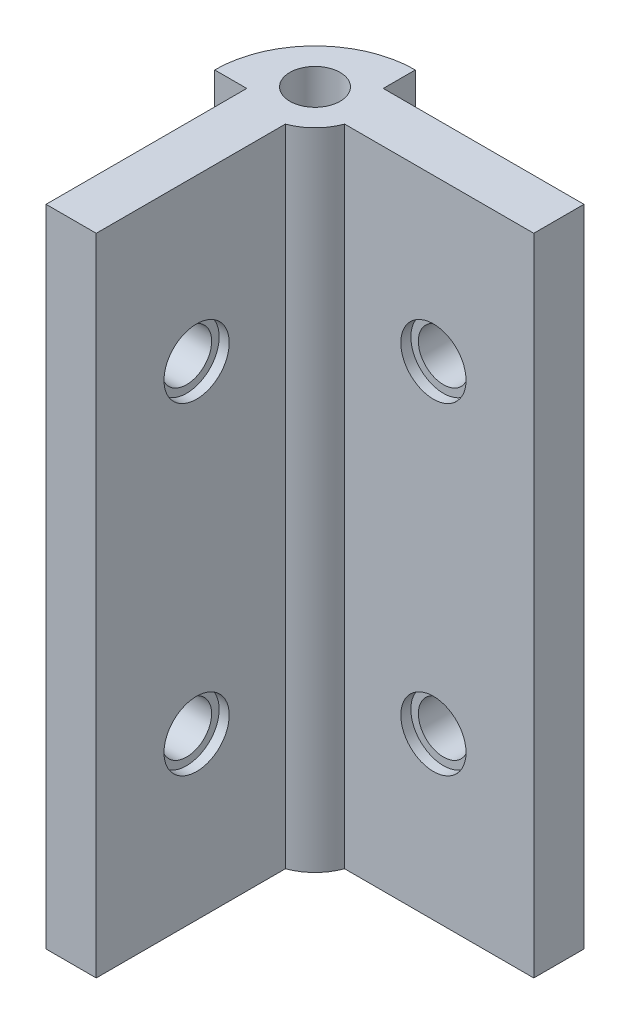
ISO-10303-21;
HEADER;
FILE_DESCRIPTION(('STEP AP214'),'2;1');
FILE_NAME('part.step','',(''),(''),'','','');
FILE_SCHEMA(('AUTOMOTIVE_DESIGN { 1 0 10303 214 1 1 1 1 }'));
ENDSEC;
DATA;
#1=APPLICATION_CONTEXT('core data for automotive mechanical design processes');
#2=APPLICATION_PROTOCOL_DEFINITION('international standard','automotive_design',2000,#1);
#3=PRODUCT_CONTEXT('',#1,'mechanical');
#4=PRODUCT('Part','Part','',(#3));
#5=PRODUCT_RELATED_PRODUCT_CATEGORY('part','',(#4));
#6=PRODUCT_DEFINITION_FORMATION('','',#4);
#7=PRODUCT_DEFINITION_CONTEXT('part definition',#1,'design');
#8=PRODUCT_DEFINITION('design','',#6,#7);
#9=PRODUCT_DEFINITION_SHAPE('','',#8);
#10=(LENGTH_UNIT() NAMED_UNIT(*) SI_UNIT(.MILLI.,.METRE.));
#11=(NAMED_UNIT(*) PLANE_ANGLE_UNIT() SI_UNIT($,.RADIAN.));
#12=(NAMED_UNIT(*) SI_UNIT($,.STERADIAN.) SOLID_ANGLE_UNIT());
#13=UNCERTAINTY_MEASURE_WITH_UNIT(LENGTH_MEASURE(1.E-05),#10,'distance_accuracy_value','');
#14=(GEOMETRIC_REPRESENTATION_CONTEXT(3) GLOBAL_UNCERTAINTY_ASSIGNED_CONTEXT((#13)) GLOBAL_UNIT_ASSIGNED_CONTEXT((#10,
#11,#12)) REPRESENTATION_CONTEXT('',''));
#15=CARTESIAN_POINT('',(0.,0.,0.));
#16=DIRECTION('',(0.,0.,1.));
#17=DIRECTION('',(1.,0.,0.));
#18=AXIS2_PLACEMENT_3D('',#15,#16,#17);
#19=CARTESIAN_POINT('',(3.55965175872163,16.0675,7.49883600615812));
#20=DIRECTION('',(0.,0.,-1.));
#21=DIRECTION('',(-1.,0.,0.));
#22=AXIS2_PLACEMENT_3D('',#19,#20,#21);
#23=CYLINDRICAL_SURFACE('',#22,2.50000000001338);
#24=CARTESIAN_POINT('',(3.55965175872163,16.0675,-19.3011639938371));
#25=DIRECTION('',(0.,0.,-1.));
#26=DIRECTION('',(-1.,0.,0.));
#27=AXIS2_PLACEMENT_3D('',#24,#25,#26);
#28=CIRCLE('',#27,2.50000000001338);
#29=CARTESIAN_POINT('',(1.05965175870825,16.0675,-19.3011639938371));
#30=VERTEX_POINT('',#29);
#31=EDGE_CURVE('E270',#30,#30,#28,.T.);
#32=ORIENTED_EDGE('',*,*,#31,.T.);
#33=EDGE_LOOP('',(#32));
#34=FACE_BOUND('',#33,.T.);
#35=CARTESIAN_POINT('',(3.55965175872163,16.0675,-15.3011639938371));
#36=DIRECTION('',(0.,0.,1.));
#37=DIRECTION('',(1.,0.,0.));
#38=AXIS2_PLACEMENT_3D('',#35,#36,#37);
#39=CIRCLE('',#38,2.50000000001338);
#40=CARTESIAN_POINT('',(6.059651758735,16.0675,-15.3011639938371));
#41=VERTEX_POINT('',#40);
#42=EDGE_CURVE('E42',#41,#41,#39,.F.);
#43=ORIENTED_EDGE('',*,*,#42,.F.);
#44=EDGE_LOOP('',(#43));
#45=FACE_BOUND('',#44,.T.);
#46=ADVANCED_FACE('F38',(#34,#45),#23,.F.);
#47=CARTESIAN_POINT('',(3.55965175872163,48.2025,7.49883600615812));
#48=DIRECTION('',(0.,0.,-1.));
#49=DIRECTION('',(-1.,0.,0.));
#50=AXIS2_PLACEMENT_3D('',#47,#48,#49);
#51=CYLINDRICAL_SURFACE('',#50,2.50000000001338);
#52=CARTESIAN_POINT('',(3.55965175872163,48.2025,-19.3011639938371));
#53=DIRECTION('',(0.,0.,-1.));
#54=DIRECTION('',(-1.,0.,0.));
#55=AXIS2_PLACEMENT_3D('',#52,#53,#54);
#56=CIRCLE('',#55,2.50000000001338);
#57=CARTESIAN_POINT('',(1.05965175870826,48.2025,-19.3011639938371));
#58=VERTEX_POINT('',#57);
#59=EDGE_CURVE('E274',#58,#58,#56,.T.);
#60=ORIENTED_EDGE('',*,*,#59,.T.);
#61=EDGE_LOOP('',(#60));
#62=FACE_BOUND('',#61,.T.);
#63=CARTESIAN_POINT('',(3.55965175872163,48.2025,-15.3011639938371));
#64=DIRECTION('',(0.,0.,1.));
#65=DIRECTION('',(1.,0.,0.));
#66=AXIS2_PLACEMENT_3D('',#63,#64,#65);
#67=CIRCLE('',#66,2.50000000001338);
#68=CARTESIAN_POINT('',(6.05965175873501,48.2025,-15.3011639938371));
#69=VERTEX_POINT('',#68);
#70=EDGE_CURVE('E224',#69,#69,#67,.F.);
#71=ORIENTED_EDGE('',*,*,#70,.F.);
#72=EDGE_LOOP('',(#71));
#73=FACE_BOUND('',#72,.T.);
#74=ADVANCED_FACE('F336',(#62,#73),#51,.F.);
#75=CARTESIAN_POINT('',(13.5596517587216,16.0675,-2.50116399384181));
#76=DIRECTION('',(-1.,0.,0.));
#77=DIRECTION('',(0.,0.,1.));
#78=AXIS2_PLACEMENT_3D('',#75,#76,#77);
#79=CYLINDRICAL_SURFACE('',#78,2.50000000003958);
#80=CARTESIAN_POINT('',(-13.2403482412736,16.0675,-2.50116399384181));
#81=DIRECTION('',(-1.,0.,0.));
#82=DIRECTION('',(0.,0.,1.));
#83=AXIS2_PLACEMENT_3D('',#80,#81,#82);
#84=CIRCLE('',#83,2.50000000003958);
#85=CARTESIAN_POINT('',(-13.2403482412736,16.0675,-0.00116399380223169));
#86=VERTEX_POINT('',#85);
#87=EDGE_CURVE('E223',#86,#86,#84,.T.);
#88=ORIENTED_EDGE('',*,*,#87,.T.);
#89=EDGE_LOOP('',(#88));
#90=FACE_BOUND('',#89,.T.);
#91=CARTESIAN_POINT('',(-9.24034824127362,16.0675,-2.50116399384181));
#92=DIRECTION('',(1.,0.,0.));
#93=DIRECTION('',(0.,0.,-1.));
#94=AXIS2_PLACEMENT_3D('',#91,#92,#93);
#95=CIRCLE('',#94,2.50000000003958);
#96=CARTESIAN_POINT('',(-9.24034824127362,16.0675,-5.00116399388139));
#97=VERTEX_POINT('',#96);
#98=EDGE_CURVE('E219',#97,#97,#95,.F.);
#99=ORIENTED_EDGE('',*,*,#98,.F.);
#100=EDGE_LOOP('',(#99));
#101=FACE_BOUND('',#100,.T.);
#102=ADVANCED_FACE('F342',(#90,#101),#79,.F.);
#103=CARTESIAN_POINT('',(13.5596517587216,48.2025,-2.50116399384181));
#104=DIRECTION('',(-1.,0.,0.));
#105=DIRECTION('',(0.,0.,1.));
#106=AXIS2_PLACEMENT_3D('',#103,#104,#105);
#107=CYLINDRICAL_SURFACE('',#106,2.50000000003958);
#108=CARTESIAN_POINT('',(-13.2403482412736,48.2025,-2.50116399384181));
#109=DIRECTION('',(-1.,0.,0.));
#110=DIRECTION('',(0.,0.,1.));
#111=AXIS2_PLACEMENT_3D('',#108,#109,#110);
#112=CIRCLE('',#111,2.50000000003958);
#113=CARTESIAN_POINT('',(-13.2403482412736,48.2025,-0.00116399380223472));
#114=VERTEX_POINT('',#113);
#115=EDGE_CURVE('E266',#114,#114,#112,.T.);
#116=ORIENTED_EDGE('',*,*,#115,.T.);
#117=EDGE_LOOP('',(#116));
#118=FACE_BOUND('',#117,.T.);
#119=CARTESIAN_POINT('',(-9.24034824127362,48.2025,-2.50116399384181));
#120=DIRECTION('',(1.,0.,0.));
#121=DIRECTION('',(0.,0.,-1.));
#122=AXIS2_PLACEMENT_3D('',#119,#120,#121);
#123=CIRCLE('',#122,2.50000000003958);
#124=CARTESIAN_POINT('',(-9.24034824127362,48.2025,-5.00116399388138));
#125=VERTEX_POINT('',#124);
#126=EDGE_CURVE('E215',#125,#125,#123,.F.);
#127=ORIENTED_EDGE('',*,*,#126,.F.);
#128=EDGE_LOOP('',(#127));
#129=FACE_BOUND('',#128,.T.);
#130=ADVANCED_FACE('F349',(#118,#129),#107,.F.);
#131=CARTESIAN_POINT('',(-9.97588214718333,64.27,-16.0366978997468));
#132=DIRECTION('',(0.,-1.,0.));
#133=DIRECTION('',(0.,0.,-1.));
#134=AXIS2_PLACEMENT_3D('',#131,#132,#133);
#135=PLANE('',#134);
#136=DIRECTION('',(0.,0.,-1.));
#137=VECTOR('',#136,1.);
#138=CARTESIAN_POINT('',(13.5596517587216,64.27,-19.3011639938371));
#139=LINE('',#138,#137);
#140=CARTESIAN_POINT('',(13.5596517587216,64.27,-14.3011639938371));
#141=VERTEX_POINT('',#140);
#142=CARTESIAN_POINT('',(13.5596517587216,64.27,-19.3011639938371));
#143=VERTEX_POINT('',#142);
#144=EDGE_CURVE('E189',#141,#143,#139,.T.);
#145=ORIENTED_EDGE('',*,*,#144,.T.);
#146=DIRECTION('',(-1.,0.,0.));
#147=VECTOR('',#146,1.);
#148=CARTESIAN_POINT('',(-6.44034824127837,64.27,-19.3011639938371));
#149=LINE('',#148,#147);
#150=CARTESIAN_POINT('',(-6.44034824127837,64.27,-19.3011639938371));
#151=VERTEX_POINT('',#150);
#152=EDGE_CURVE('E113',#143,#151,#149,.T.);
#153=ORIENTED_EDGE('',*,*,#152,.T.);
#154=DIRECTION('',(0.,0.,-1.));
#155=VECTOR('',#154,1.);
#156=CARTESIAN_POINT('',(-6.44034824127837,64.27,-22.5011639938419));
#157=LINE('',#156,#155);
#158=CARTESIAN_POINT('',(-6.44034824127837,64.27,-22.5011639938419));
#159=VERTEX_POINT('',#158);
#160=EDGE_CURVE('E289',#151,#159,#157,.T.);
#161=ORIENTED_EDGE('',*,*,#160,.T.);
#162=CARTESIAN_POINT('',(-6.44034824127834,64.27,-12.5011639938419));
#163=DIRECTION('',(0.,1.,0.));
#164=DIRECTION('',(0.,0.,1.));
#165=AXIS2_PLACEMENT_3D('',#162,#163,#164);
#166=CIRCLE('',#165,10.);
#167=CARTESIAN_POINT('',(-16.4403482412784,64.27,-12.5011639938419));
#168=VERTEX_POINT('',#167);
#169=EDGE_CURVE('E292',#159,#168,#166,.T.);
#170=ORIENTED_EDGE('',*,*,#169,.T.);
#171=DIRECTION('',(1.,0.,0.));
#172=VECTOR('',#171,1.);
#173=CARTESIAN_POINT('',(-16.4403482412784,64.27,-12.5011639938419));
#174=LINE('',#173,#172);
#175=CARTESIAN_POINT('',(-13.2403482412736,64.27,-12.5011639938419));
#176=VERTEX_POINT('',#175);
#177=EDGE_CURVE('E295',#168,#176,#174,.T.);
#178=ORIENTED_EDGE('',*,*,#177,.T.);
#179=DIRECTION('',(0.,0.,1.));
#180=VECTOR('',#179,1.);
#181=CARTESIAN_POINT('',(-13.2403482412736,64.27,-12.5011639938419));
#182=LINE('',#181,#180);
#183=CARTESIAN_POINT('',(-13.2403482412736,64.27,7.49883600615812));
#184=VERTEX_POINT('',#183);
#185=EDGE_CURVE('E298',#176,#184,#182,.T.);
#186=ORIENTED_EDGE('',*,*,#185,.T.);
#187=DIRECTION('',(1.,0.,0.));
#188=VECTOR('',#187,1.);
#189=CARTESIAN_POINT('',(-13.2403482412736,64.27,7.49883600615812));
#190=LINE('',#189,#188);
#191=CARTESIAN_POINT('',(-8.24034824127362,64.27,7.49883600615812));
#192=VERTEX_POINT('',#191);
#193=EDGE_CURVE('E144',#184,#192,#190,.T.);
#194=ORIENTED_EDGE('',*,*,#193,.T.);
#195=DIRECTION('',(0.,0.,-1.));
#196=VECTOR('',#195,1.);
#197=CARTESIAN_POINT('',(-8.24034824127362,64.27,-11.3475698292162));
#198=LINE('',#197,#196);
#199=CARTESIAN_POINT('',(-8.24034824127362,64.27,-11.3475698292162));
#200=VERTEX_POINT('',#199);
#201=EDGE_CURVE('E137',#192,#200,#198,.T.);
#202=ORIENTED_EDGE('',*,*,#201,.T.);
#203=CARTESIAN_POINT('',(-9.97588214718333,64.27,-16.0366978997468));
#204=DIRECTION('',(0.,1.,0.));
#205=DIRECTION('',(0.,0.,-1.));
#206=AXIS2_PLACEMENT_3D('',#203,#204,#205);
#207=CIRCLE('',#206,5.00000000004007);
#208=CARTESIAN_POINT('',(-5.28675407665268,64.27,-14.3011639938371));
#209=VERTEX_POINT('',#208);
#210=EDGE_CURVE('E142',#200,#209,#207,.T.);
#211=ORIENTED_EDGE('',*,*,#210,.T.);
#212=DIRECTION('',(1.,0.,0.));
#213=VECTOR('',#212,1.);
#214=CARTESIAN_POINT('',(-5.28675407665268,64.27,-14.3011639938371));
#215=LINE('',#214,#213);
#216=EDGE_CURVE('E61',#209,#141,#215,.T.);
#217=ORIENTED_EDGE('',*,*,#216,.T.);
#218=EDGE_LOOP('',(#145,#153,#161,#170,#178,#186,#194,#202,#211,#217));
#219=FACE_BOUND('',#218,.T.);
#220=CARTESIAN_POINT('',(-9.97588214718333,64.27,-16.0366978997468));
#221=DIRECTION('',(0.,1.,0.));
#222=DIRECTION('',(0.,0.,1.));
#223=AXIS2_PLACEMENT_3D('',#220,#221,#222);
#224=CIRCLE('',#223,2.50000000002665);
#225=CARTESIAN_POINT('',(-9.97588214718333,64.27,-13.5366978997202));
#226=VERTEX_POINT('',#225);
#227=EDGE_CURVE('E172',#226,#226,#224,.T.);
#228=ORIENTED_EDGE('',*,*,#227,.F.);
#229=EDGE_LOOP('',(#228));
#230=FACE_BOUND('',#229,.T.);
#231=ADVANCED_FACE('F139',(#219,#230),#135,.F.);
#232=CARTESIAN_POINT('',(-9.97588214718333,0.,-16.0366978997468));
#233=DIRECTION('',(0.,-1.,0.));
#234=DIRECTION('',(0.,0.,-1.));
#235=AXIS2_PLACEMENT_3D('',#232,#233,#234);
#236=PLANE('',#235);
#237=DIRECTION('',(0.,0.,-1.));
#238=VECTOR('',#237,1.);
#239=CARTESIAN_POINT('',(13.5596517587216,0.,-19.3011639938371));
#240=LINE('',#239,#238);
#241=CARTESIAN_POINT('',(13.5596517587216,0.,-14.3011639938371));
#242=VERTEX_POINT('',#241);
#243=CARTESIAN_POINT('',(13.5596517587216,0.,-19.3011639938371));
#244=VERTEX_POINT('',#243);
#245=EDGE_CURVE('E167',#242,#244,#240,.T.);
#246=ORIENTED_EDGE('',*,*,#245,.F.);
#247=DIRECTION('',(1.,0.,0.));
#248=VECTOR('',#247,1.);
#249=CARTESIAN_POINT('',(-5.28675407665268,0.,-14.3011639938371));
#250=LINE('',#249,#248);
#251=CARTESIAN_POINT('',(-5.28675407665268,0.,-14.3011639938371));
#252=VERTEX_POINT('',#251);
#253=EDGE_CURVE('E105',#252,#242,#250,.T.);
#254=ORIENTED_EDGE('',*,*,#253,.F.);
#255=CARTESIAN_POINT('',(-9.97588214718333,0.,-16.0366978997468));
#256=DIRECTION('',(0.,1.,0.));
#257=DIRECTION('',(0.,0.,-1.));
#258=AXIS2_PLACEMENT_3D('',#255,#256,#257);
#259=CIRCLE('',#258,5.00000000004007);
#260=CARTESIAN_POINT('',(-8.24034824127362,0.,-11.3475698292162));
#261=VERTEX_POINT('',#260);
#262=EDGE_CURVE('E97',#261,#252,#259,.T.);
#263=ORIENTED_EDGE('',*,*,#262,.F.);
#264=DIRECTION('',(0.,0.,-1.));
#265=VECTOR('',#264,1.);
#266=CARTESIAN_POINT('',(-8.24034824127362,0.,-11.3475698292162));
#267=LINE('',#266,#265);
#268=CARTESIAN_POINT('',(-8.24034824127362,0.,7.49883600615812));
#269=VERTEX_POINT('',#268);
#270=EDGE_CURVE('E153',#269,#261,#267,.T.);
#271=ORIENTED_EDGE('',*,*,#270,.F.);
#272=DIRECTION('',(1.,0.,0.));
#273=VECTOR('',#272,1.);
#274=CARTESIAN_POINT('',(-13.2403482412736,0.,7.49883600615812));
#275=LINE('',#274,#273);
#276=CARTESIAN_POINT('',(-13.2403482412736,0.,7.49883600615812));
#277=VERTEX_POINT('',#276);
#278=EDGE_CURVE('E183',#277,#269,#275,.T.);
#279=ORIENTED_EDGE('',*,*,#278,.F.);
#280=DIRECTION('',(0.,0.,1.));
#281=VECTOR('',#280,1.);
#282=CARTESIAN_POINT('',(-13.2403482412736,0.,-12.5011639938419));
#283=LINE('',#282,#281);
#284=CARTESIAN_POINT('',(-13.2403482412736,0.,-12.5011639938419));
#285=VERTEX_POINT('',#284);
#286=EDGE_CURVE('E181',#285,#277,#283,.T.);
#287=ORIENTED_EDGE('',*,*,#286,.F.);
#288=DIRECTION('',(1.,0.,0.));
#289=VECTOR('',#288,1.);
#290=CARTESIAN_POINT('',(-16.4403482412784,0.,-12.5011639938419));
#291=LINE('',#290,#289);
#292=CARTESIAN_POINT('',(-16.4403482412784,0.,-12.5011639938419));
#293=VERTEX_POINT('',#292);
#294=EDGE_CURVE('E179',#293,#285,#291,.T.);
#295=ORIENTED_EDGE('',*,*,#294,.F.);
#296=CARTESIAN_POINT('',(-6.44034824127834,0.,-12.5011639938419));
#297=DIRECTION('',(0.,1.,0.));
#298=DIRECTION('',(0.,0.,1.));
#299=AXIS2_PLACEMENT_3D('',#296,#297,#298);
#300=CIRCLE('',#299,10.);
#301=CARTESIAN_POINT('',(-6.44034824127837,0.,-22.5011639938419));
#302=VERTEX_POINT('',#301);
#303=EDGE_CURVE('E177',#302,#293,#300,.T.);
#304=ORIENTED_EDGE('',*,*,#303,.F.);
#305=DIRECTION('',(0.,0.,-1.));
#306=VECTOR('',#305,1.);
#307=CARTESIAN_POINT('',(-6.44034824127837,0.,-22.5011639938419));
#308=LINE('',#307,#306);
#309=CARTESIAN_POINT('',(-6.44034824127837,0.,-19.3011639938371));
#310=VERTEX_POINT('',#309);
#311=EDGE_CURVE('E175',#310,#302,#308,.T.);
#312=ORIENTED_EDGE('',*,*,#311,.F.);
#313=DIRECTION('',(-1.,0.,0.));
#314=VECTOR('',#313,1.);
#315=CARTESIAN_POINT('',(-6.44034824127837,0.,-19.3011639938371));
#316=LINE('',#315,#314);
#317=EDGE_CURVE('E171',#244,#310,#316,.T.);
#318=ORIENTED_EDGE('',*,*,#317,.F.);
#319=EDGE_LOOP('',(#246,#254,#263,#271,#279,#287,#295,#304,#312,#318));
#320=FACE_BOUND('',#319,.T.);
#321=CARTESIAN_POINT('',(-9.97588214718333,0.,-16.0366978997468));
#322=DIRECTION('',(0.,1.,0.));
#323=DIRECTION('',(0.,0.,1.));
#324=AXIS2_PLACEMENT_3D('',#321,#322,#323);
#325=CIRCLE('',#324,2.50000000002665);
#326=CARTESIAN_POINT('',(-9.97588214718333,0.,-13.5366978997202));
#327=VERTEX_POINT('',#326);
#328=EDGE_CURVE('E277',#327,#327,#325,.T.);
#329=ORIENTED_EDGE('',*,*,#328,.T.);
#330=EDGE_LOOP('',(#329));
#331=FACE_BOUND('',#330,.T.);
#332=ADVANCED_FACE('F313',(#320,#331),#236,.T.);
#333=CARTESIAN_POINT('',(13.5596517587216,64.27,-19.3011639938371));
#334=DIRECTION('',(-1.,0.,0.));
#335=DIRECTION('',(0.,0.,1.));
#336=AXIS2_PLACEMENT_3D('',#333,#334,#335);
#337=PLANE('',#336);
#338=ORIENTED_EDGE('',*,*,#245,.T.);
#339=DIRECTION('',(0.,-1.,0.));
#340=VECTOR('',#339,1.);
#341=CARTESIAN_POINT('',(13.5596517587216,64.27,-19.3011639938371));
#342=LINE('',#341,#340);
#343=EDGE_CURVE('E11',#143,#244,#342,.T.);
#344=ORIENTED_EDGE('',*,*,#343,.F.);
#345=ORIENTED_EDGE('',*,*,#144,.F.);
#346=DIRECTION('',(0.,-1.,0.));
#347=VECTOR('',#346,1.);
#348=CARTESIAN_POINT('',(13.5596517587216,64.27,-14.3011639938371));
#349=LINE('',#348,#347);
#350=EDGE_CURVE('E163',#141,#242,#349,.T.);
#351=ORIENTED_EDGE('',*,*,#350,.T.);
#352=EDGE_LOOP('',(#338,#344,#345,#351));
#353=FACE_BOUND('',#352,.T.);
#354=ADVANCED_FACE('F40',(#353),#337,.F.);
#355=CARTESIAN_POINT('',(-6.44034824127837,64.27,-19.3011639938371));
#356=DIRECTION('',(0.,0.,1.));
#357=DIRECTION('',(1.,0.,0.));
#358=AXIS2_PLACEMENT_3D('',#355,#356,#357);
#359=PLANE('',#358);
#360=ORIENTED_EDGE('',*,*,#59,.F.);
#361=EDGE_LOOP('',(#360));
#362=FACE_BOUND('',#361,.T.);
#363=ORIENTED_EDGE('',*,*,#31,.F.);
#364=EDGE_LOOP('',(#363));
#365=FACE_BOUND('',#364,.T.);
#366=ORIENTED_EDGE('',*,*,#317,.T.);
#367=DIRECTION('',(0.,-1.,0.));
#368=VECTOR('',#367,1.);
#369=CARTESIAN_POINT('',(-6.44034824127837,64.27,-19.3011639938371));
#370=LINE('',#369,#368);
#371=EDGE_CURVE('E49',#151,#310,#370,.T.);
#372=ORIENTED_EDGE('',*,*,#371,.F.);
#373=ORIENTED_EDGE('',*,*,#152,.F.);
#374=ORIENTED_EDGE('',*,*,#343,.T.);
#375=EDGE_LOOP('',(#366,#372,#373,#374));
#376=FACE_BOUND('',#375,.T.);
#377=ADVANCED_FACE('F354',(#362,#365,#376),#359,.F.);
#378=CARTESIAN_POINT('',(-6.44034824127837,64.27,-22.5011639938419));
#379=DIRECTION('',(-1.,0.,0.));
#380=DIRECTION('',(0.,0.,1.));
#381=AXIS2_PLACEMENT_3D('',#378,#379,#380);
#382=PLANE('',#381);
#383=ORIENTED_EDGE('',*,*,#311,.T.);
#384=DIRECTION('',(0.,-1.,0.));
#385=VECTOR('',#384,1.);
#386=CARTESIAN_POINT('',(-6.44034824127837,64.27,-22.5011639938419));
#387=LINE('',#386,#385);
#388=EDGE_CURVE('E208',#159,#302,#387,.T.);
#389=ORIENTED_EDGE('',*,*,#388,.F.);
#390=ORIENTED_EDGE('',*,*,#160,.F.);
#391=ORIENTED_EDGE('',*,*,#371,.T.);
#392=EDGE_LOOP('',(#383,#389,#390,#391));
#393=FACE_BOUND('',#392,.T.);
#394=ADVANCED_FACE('F358',(#393),#382,.F.);
#395=CARTESIAN_POINT('',(-6.44034824127834,64.27,-12.5011639938419));
#396=DIRECTION('',(0.,-1.,0.));
#397=DIRECTION('',(0.,0.,-1.));
#398=AXIS2_PLACEMENT_3D('',#395,#396,#397);
#399=CYLINDRICAL_SURFACE('',#398,10.);
#400=ORIENTED_EDGE('',*,*,#303,.T.);
#401=DIRECTION('',(0.,-1.,0.));
#402=VECTOR('',#401,1.);
#403=CARTESIAN_POINT('',(-16.4403482412784,64.27,-12.5011639938419));
#404=LINE('',#403,#402);
#405=EDGE_CURVE('E204',#168,#293,#404,.T.);
#406=ORIENTED_EDGE('',*,*,#405,.F.);
#407=ORIENTED_EDGE('',*,*,#169,.F.);
#408=ORIENTED_EDGE('',*,*,#388,.T.);
#409=EDGE_LOOP('',(#400,#406,#407,#408));
#410=FACE_BOUND('',#409,.T.);
#411=ADVANCED_FACE('F363',(#410),#399,.T.);
#412=CARTESIAN_POINT('',(-16.4403482412784,64.27,-12.5011639938419));
#413=DIRECTION('',(0.,0.,-1.));
#414=DIRECTION('',(-1.,0.,0.));
#415=AXIS2_PLACEMENT_3D('',#412,#413,#414);
#416=PLANE('',#415);
#417=ORIENTED_EDGE('',*,*,#294,.T.);
#418=DIRECTION('',(0.,-1.,0.));
#419=VECTOR('',#418,1.);
#420=CARTESIAN_POINT('',(-13.2403482412736,64.27,-12.5011639938419));
#421=LINE('',#420,#419);
#422=EDGE_CURVE('E200',#176,#285,#421,.T.);
#423=ORIENTED_EDGE('',*,*,#422,.F.);
#424=ORIENTED_EDGE('',*,*,#177,.F.);
#425=ORIENTED_EDGE('',*,*,#405,.T.);
#426=EDGE_LOOP('',(#417,#423,#424,#425));
#427=FACE_BOUND('',#426,.T.);
#428=ADVANCED_FACE('F371',(#427),#416,.F.);
#429=CARTESIAN_POINT('',(-13.2403482412736,64.27,-12.5011639938419));
#430=DIRECTION('',(1.,0.,0.));
#431=DIRECTION('',(0.,0.,-1.));
#432=AXIS2_PLACEMENT_3D('',#429,#430,#431);
#433=PLANE('',#432);
#434=ORIENTED_EDGE('',*,*,#115,.F.);
#435=EDGE_LOOP('',(#434));
#436=FACE_BOUND('',#435,.T.);
#437=ORIENTED_EDGE('',*,*,#87,.F.);
#438=EDGE_LOOP('',(#437));
#439=FACE_BOUND('',#438,.T.);
#440=ORIENTED_EDGE('',*,*,#286,.T.);
#441=DIRECTION('',(0.,-1.,0.));
#442=VECTOR('',#441,1.);
#443=CARTESIAN_POINT('',(-13.2403482412736,64.27,7.49883600615812));
#444=LINE('',#443,#442);
#445=EDGE_CURVE('E196',#184,#277,#444,.T.);
#446=ORIENTED_EDGE('',*,*,#445,.F.);
#447=ORIENTED_EDGE('',*,*,#185,.F.);
#448=ORIENTED_EDGE('',*,*,#422,.T.);
#449=EDGE_LOOP('',(#440,#446,#447,#448));
#450=FACE_BOUND('',#449,.T.);
#451=ADVANCED_FACE('F306',(#436,#439,#450),#433,.F.);
#452=CARTESIAN_POINT('',(-13.2403482412736,64.27,7.49883600615812));
#453=DIRECTION('',(0.,0.,-1.));
#454=DIRECTION('',(-1.,0.,0.));
#455=AXIS2_PLACEMENT_3D('',#452,#453,#454);
#456=PLANE('',#455);
#457=ORIENTED_EDGE('',*,*,#278,.T.);
#458=DIRECTION('',(0.,-1.,0.));
#459=VECTOR('',#458,1.);
#460=CARTESIAN_POINT('',(-8.24034824127362,64.27,7.49883600615812));
#461=LINE('',#460,#459);
#462=EDGE_CURVE('E155',#192,#269,#461,.T.);
#463=ORIENTED_EDGE('',*,*,#462,.F.);
#464=ORIENTED_EDGE('',*,*,#193,.F.);
#465=ORIENTED_EDGE('',*,*,#445,.T.);
#466=EDGE_LOOP('',(#457,#463,#464,#465));
#467=FACE_BOUND('',#466,.T.);
#468=ADVANCED_FACE('F310',(#467),#456,.F.);
#469=CARTESIAN_POINT('',(-8.24034824127362,64.27,-11.3475698292162));
#470=DIRECTION('',(-1.,0.,0.));
#471=DIRECTION('',(0.,0.,1.));
#472=AXIS2_PLACEMENT_3D('',#469,#470,#471);
#473=PLANE('',#472);
#474=CARTESIAN_POINT('',(-8.24034824127362,48.2025,-2.50116399384181));
#475=DIRECTION('',(1.,0.,0.));
#476=DIRECTION('',(0.,0.,-1.));
#477=AXIS2_PLACEMENT_3D('',#474,#475,#476);
#478=CIRCLE('',#477,3.25);
#479=CARTESIAN_POINT('',(-8.24034824127362,48.2025,-5.75116399384181));
#480=VERTEX_POINT('',#479);
#481=EDGE_CURVE('E255',#480,#480,#478,.T.);
#482=ORIENTED_EDGE('',*,*,#481,.F.);
#483=EDGE_LOOP('',(#482));
#484=FACE_BOUND('',#483,.T.);
#485=CARTESIAN_POINT('',(-8.24034824127362,16.0675,-2.50116399384181));
#486=DIRECTION('',(1.,0.,0.));
#487=DIRECTION('',(0.,0.,-1.));
#488=AXIS2_PLACEMENT_3D('',#485,#486,#487);
#489=CIRCLE('',#488,3.25);
#490=CARTESIAN_POINT('',(-8.24034824127362,16.0675,-5.75116399384181));
#491=VERTEX_POINT('',#490);
#492=EDGE_CURVE('E233',#491,#491,#489,.T.);
#493=ORIENTED_EDGE('',*,*,#492,.F.);
#494=EDGE_LOOP('',(#493));
#495=FACE_BOUND('',#494,.T.);
#496=ORIENTED_EDGE('',*,*,#270,.T.);
#497=DIRECTION('',(0.,-1.,0.));
#498=VECTOR('',#497,1.);
#499=CARTESIAN_POINT('',(-8.24034824127362,64.27,-11.3475698292162));
#500=LINE('',#499,#498);
#501=EDGE_CURVE('E150',#200,#261,#500,.T.);
#502=ORIENTED_EDGE('',*,*,#501,.F.);
#503=ORIENTED_EDGE('',*,*,#201,.F.);
#504=ORIENTED_EDGE('',*,*,#462,.T.);
#505=EDGE_LOOP('',(#496,#502,#503,#504));
#506=FACE_BOUND('',#505,.T.);
#507=ADVANCED_FACE('F151',(#484,#495,#506),#473,.F.);
#508=CARTESIAN_POINT('',(-9.97588214718333,64.27,-16.0366978997468));
#509=DIRECTION('',(0.,-1.,0.));
#510=DIRECTION('',(0.,0.,-1.));
#511=AXIS2_PLACEMENT_3D('',#508,#509,#510);
#512=CYLINDRICAL_SURFACE('',#511,5.00000000004007);
#513=ORIENTED_EDGE('',*,*,#262,.T.);
#514=DIRECTION('',(0.,-1.,0.));
#515=VECTOR('',#514,1.);
#516=CARTESIAN_POINT('',(-5.28675407665268,64.27,-14.3011639938371));
#517=LINE('',#516,#515);
#518=EDGE_CURVE('E156',#209,#252,#517,.T.);
#519=ORIENTED_EDGE('',*,*,#518,.F.);
#520=ORIENTED_EDGE('',*,*,#210,.F.);
#521=ORIENTED_EDGE('',*,*,#501,.T.);
#522=EDGE_LOOP('',(#513,#519,#520,#521));
#523=FACE_BOUND('',#522,.T.);
#524=ADVANCED_FACE('F158',(#523),#512,.T.);
#525=CARTESIAN_POINT('',(-5.28675407665268,64.27,-14.3011639938371));
#526=DIRECTION('',(0.,0.,-1.));
#527=DIRECTION('',(-1.,0.,0.));
#528=AXIS2_PLACEMENT_3D('',#525,#526,#527);
#529=PLANE('',#528);
#530=CARTESIAN_POINT('',(3.55965175872163,48.2025,-14.3011639938371));
#531=DIRECTION('',(0.,0.,1.));
#532=DIRECTION('',(1.,0.,0.));
#533=AXIS2_PLACEMENT_3D('',#530,#531,#532);
#534=CIRCLE('',#533,3.24999999998663);
#535=CARTESIAN_POINT('',(6.80965175870826,48.2025,-14.3011639938371));
#536=VERTEX_POINT('',#535);
#537=EDGE_CURVE('E236',#536,#536,#534,.T.);
#538=ORIENTED_EDGE('',*,*,#537,.F.);
#539=EDGE_LOOP('',(#538));
#540=FACE_BOUND('',#539,.T.);
#541=CARTESIAN_POINT('',(3.55965175872163,16.0675,-14.3011639938371));
#542=DIRECTION('',(0.,0.,1.));
#543=DIRECTION('',(1.,0.,0.));
#544=AXIS2_PLACEMENT_3D('',#541,#542,#543);
#545=CIRCLE('',#544,3.24999999998663);
#546=CARTESIAN_POINT('',(6.80965175870826,16.0675,-14.3011639938371));
#547=VERTEX_POINT('',#546);
#548=EDGE_CURVE('E249',#547,#547,#545,.T.);
#549=ORIENTED_EDGE('',*,*,#548,.F.);
#550=EDGE_LOOP('',(#549));
#551=FACE_BOUND('',#550,.T.);
#552=ORIENTED_EDGE('',*,*,#253,.T.);
#553=ORIENTED_EDGE('',*,*,#350,.F.);
#554=ORIENTED_EDGE('',*,*,#216,.F.);
#555=ORIENTED_EDGE('',*,*,#518,.T.);
#556=EDGE_LOOP('',(#552,#553,#554,#555));
#557=FACE_BOUND('',#556,.T.);
#558=ADVANCED_FACE('F319',(#540,#551,#557),#529,.F.);
#559=CARTESIAN_POINT('',(-9.97588214718333,64.27,-16.0366978997468));
#560=DIRECTION('',(0.,-1.,0.));
#561=DIRECTION('',(0.,0.,-1.));
#562=AXIS2_PLACEMENT_3D('',#559,#560,#561);
#563=CYLINDRICAL_SURFACE('',#562,2.50000000002665);
#564=ORIENTED_EDGE('',*,*,#227,.T.);
#565=EDGE_LOOP('',(#564));
#566=FACE_BOUND('',#565,.T.);
#567=ORIENTED_EDGE('',*,*,#328,.F.);
#568=EDGE_LOOP('',(#567));
#569=FACE_BOUND('',#568,.T.);
#570=ADVANCED_FACE('F321',(#566,#569),#563,.F.);
#571=CARTESIAN_POINT('',(-9.24034824127362,48.2025,-2.50116399384181));
#572=DIRECTION('',(1.,0.,0.));
#573=DIRECTION('',(0.,0.,-1.));
#574=AXIS2_PLACEMENT_3D('',#571,#572,#573);
#575=PLANE('',#574);
#576=CARTESIAN_POINT('',(-9.24034824127362,48.2025,-2.50116399384181));
#577=DIRECTION('',(1.,0.,0.));
#578=DIRECTION('',(0.,0.,-1.));
#579=AXIS2_PLACEMENT_3D('',#576,#577,#578);
#580=CIRCLE('',#579,3.25);
#581=CARTESIAN_POINT('',(-9.24034824127362,48.2025,-5.75116399384181));
#582=VERTEX_POINT('',#581);
#583=EDGE_CURVE('E220',#582,#582,#580,.T.);
#584=ORIENTED_EDGE('',*,*,#583,.T.);
#585=EDGE_LOOP('',(#584));
#586=FACE_BOUND('',#585,.T.);
#587=ORIENTED_EDGE('',*,*,#126,.T.);
#588=EDGE_LOOP('',(#587));
#589=FACE_BOUND('',#588,.T.);
#590=ADVANCED_FACE('F328',(#586,#589),#575,.T.);
#591=CARTESIAN_POINT('',(-9.24034824127362,48.2025,-2.50116399384181));
#592=DIRECTION('',(1.,0.,0.));
#593=DIRECTION('',(0.,0.,-1.));
#594=AXIS2_PLACEMENT_3D('',#591,#592,#593);
#595=CYLINDRICAL_SURFACE('',#594,3.25);
#596=ORIENTED_EDGE('',*,*,#583,.F.);
#597=EDGE_LOOP('',(#596));
#598=FACE_BOUND('',#597,.T.);
#599=ORIENTED_EDGE('',*,*,#481,.T.);
#600=EDGE_LOOP('',(#599));
#601=FACE_BOUND('',#600,.T.);
#602=ADVANCED_FACE('F401',(#598,#601),#595,.F.);
#603=CARTESIAN_POINT('',(-9.24034824127362,16.0675,-2.50116399384181));
#604=DIRECTION('',(1.,0.,0.));
#605=DIRECTION('',(0.,0.,-1.));
#606=AXIS2_PLACEMENT_3D('',#603,#604,#605);
#607=PLANE('',#606);
#608=CARTESIAN_POINT('',(-9.24034824127362,16.0675,-2.50116399384181));
#609=DIRECTION('',(1.,0.,0.));
#610=DIRECTION('',(0.,0.,-1.));
#611=AXIS2_PLACEMENT_3D('',#608,#609,#610);
#612=CIRCLE('',#611,3.25);
#613=CARTESIAN_POINT('',(-9.24034824127362,16.0675,-5.75116399384181));
#614=VERTEX_POINT('',#613);
#615=EDGE_CURVE('E259',#614,#614,#612,.T.);
#616=ORIENTED_EDGE('',*,*,#615,.T.);
#617=EDGE_LOOP('',(#616));
#618=FACE_BOUND('',#617,.T.);
#619=ORIENTED_EDGE('',*,*,#98,.T.);
#620=EDGE_LOOP('',(#619));
#621=FACE_BOUND('',#620,.T.);
#622=ADVANCED_FACE('F392',(#618,#621),#607,.T.);
#623=CARTESIAN_POINT('',(-9.24034824127362,16.0675,-2.50116399384181));
#624=DIRECTION('',(1.,0.,0.));
#625=DIRECTION('',(0.,0.,-1.));
#626=AXIS2_PLACEMENT_3D('',#623,#624,#625);
#627=CYLINDRICAL_SURFACE('',#626,3.25);
#628=ORIENTED_EDGE('',*,*,#615,.F.);
#629=EDGE_LOOP('',(#628));
#630=FACE_BOUND('',#629,.T.);
#631=ORIENTED_EDGE('',*,*,#492,.T.);
#632=EDGE_LOOP('',(#631));
#633=FACE_BOUND('',#632,.T.);
#634=ADVANCED_FACE('F389',(#630,#633),#627,.F.);
#635=CARTESIAN_POINT('',(3.55965175872163,48.2025,-15.3011639938371));
#636=DIRECTION('',(0.,0.,1.));
#637=DIRECTION('',(1.,0.,0.));
#638=AXIS2_PLACEMENT_3D('',#635,#636,#637);
#639=PLANE('',#638);
#640=CARTESIAN_POINT('',(3.55965175872163,48.2025,-15.3011639938371));
#641=DIRECTION('',(0.,0.,1.));
#642=DIRECTION('',(1.,0.,0.));
#643=AXIS2_PLACEMENT_3D('',#640,#641,#642);
#644=CIRCLE('',#643,3.24999999998663);
#645=CARTESIAN_POINT('',(6.80965175870826,48.2025,-15.3011639938371));
#646=VERTEX_POINT('',#645);
#647=EDGE_CURVE('E227',#646,#646,#644,.T.);
#648=ORIENTED_EDGE('',*,*,#647,.T.);
#649=EDGE_LOOP('',(#648));
#650=FACE_BOUND('',#649,.T.);
#651=ORIENTED_EDGE('',*,*,#70,.T.);
#652=EDGE_LOOP('',(#651));
#653=FACE_BOUND('',#652,.T.);
#654=ADVANCED_FACE('F391',(#650,#653),#639,.T.);
#655=CARTESIAN_POINT('',(3.55965175872163,48.2025,-15.3011639938371));
#656=DIRECTION('',(0.,0.,1.));
#657=DIRECTION('',(1.,0.,0.));
#658=AXIS2_PLACEMENT_3D('',#655,#656,#657);
#659=CYLINDRICAL_SURFACE('',#658,3.24999999998663);
#660=ORIENTED_EDGE('',*,*,#647,.F.);
#661=EDGE_LOOP('',(#660));
#662=FACE_BOUND('',#661,.T.);
#663=ORIENTED_EDGE('',*,*,#537,.T.);
#664=EDGE_LOOP('',(#663));
#665=FACE_BOUND('',#664,.T.);
#666=ADVANCED_FACE('F399',(#662,#665),#659,.F.);
#667=CARTESIAN_POINT('',(3.55965175872163,16.0675,-15.3011639938371));
#668=DIRECTION('',(0.,0.,1.));
#669=DIRECTION('',(1.,0.,0.));
#670=AXIS2_PLACEMENT_3D('',#667,#668,#669);
#671=PLANE('',#670);
#672=CARTESIAN_POINT('',(3.55965175872163,16.0675,-15.3011639938371));
#673=DIRECTION('',(0.,0.,1.));
#674=DIRECTION('',(1.,0.,0.));
#675=AXIS2_PLACEMENT_3D('',#672,#673,#674);
#676=CIRCLE('',#675,3.24999999998663);
#677=CARTESIAN_POINT('',(6.80965175870826,16.0675,-15.3011639938371));
#678=VERTEX_POINT('',#677);
#679=EDGE_CURVE('E243',#678,#678,#676,.T.);
#680=ORIENTED_EDGE('',*,*,#679,.T.);
#681=EDGE_LOOP('',(#680));
#682=FACE_BOUND('',#681,.T.);
#683=ORIENTED_EDGE('',*,*,#42,.T.);
#684=EDGE_LOOP('',(#683));
#685=FACE_BOUND('',#684,.T.);
#686=ADVANCED_FACE('F544',(#682,#685),#671,.T.);
#687=CARTESIAN_POINT('',(3.55965175872163,16.0675,-15.3011639938371));
#688=DIRECTION('',(0.,0.,1.));
#689=DIRECTION('',(1.,0.,0.));
#690=AXIS2_PLACEMENT_3D('',#687,#688,#689);
#691=CYLINDRICAL_SURFACE('',#690,3.24999999998663);
#692=ORIENTED_EDGE('',*,*,#679,.F.);
#693=EDGE_LOOP('',(#692));
#694=FACE_BOUND('',#693,.T.);
#695=ORIENTED_EDGE('',*,*,#548,.T.);
#696=EDGE_LOOP('',(#695));
#697=FACE_BOUND('',#696,.T.);
#698=ADVANCED_FACE('F554',(#694,#697),#691,.F.);
#699=CLOSED_SHELL('',(#46,#74,#102,#130,#231,#332,#354,#377,#394,#411,#428,#451,#468,#507,#524,
#558,#570,#590,#602,#622,#634,#654,#666,#686,#698));
#700=MANIFOLD_SOLID_BREP('B2',#699);
#701=ADVANCED_BREP_SHAPE_REPRESENTATION('',(#18,#700),#14);
#702=SHAPE_DEFINITION_REPRESENTATION(#9,#701);
ENDSEC;
END-ISO-10303-21;
